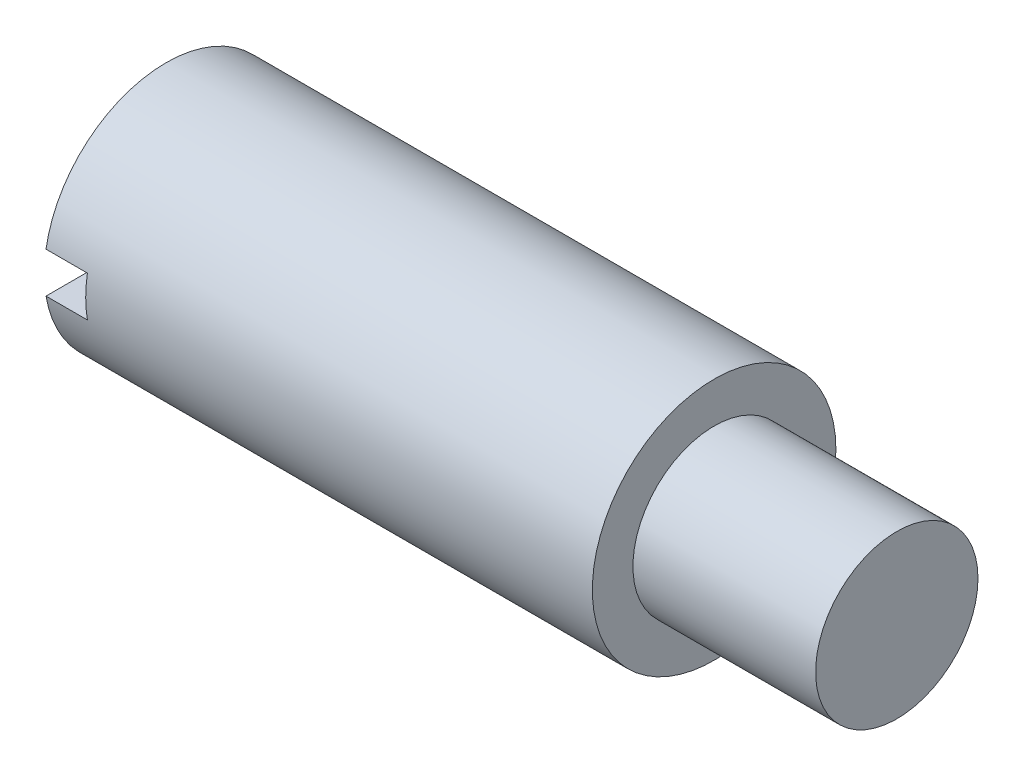
ISO-10303-21;
HEADER;
FILE_DESCRIPTION(('STEP AP214'),'2;1');
FILE_NAME('part.step','',(''),(''),'','','');
FILE_SCHEMA(('AUTOMOTIVE_DESIGN { 1 0 10303 214 1 1 1 1 }'));
ENDSEC;
DATA;
#1=APPLICATION_CONTEXT('core data for automotive mechanical design processes');
#2=APPLICATION_PROTOCOL_DEFINITION('international standard','automotive_design',2000,#1);
#3=PRODUCT_CONTEXT('',#1,'mechanical');
#4=PRODUCT('Part','Part','',(#3));
#5=PRODUCT_RELATED_PRODUCT_CATEGORY('part','',(#4));
#6=PRODUCT_DEFINITION_FORMATION('','',#4);
#7=PRODUCT_DEFINITION_CONTEXT('part definition',#1,'design');
#8=PRODUCT_DEFINITION('design','',#6,#7);
#9=PRODUCT_DEFINITION_SHAPE('','',#8);
#10=(LENGTH_UNIT() NAMED_UNIT(*) SI_UNIT(.MILLI.,.METRE.));
#11=(NAMED_UNIT(*) PLANE_ANGLE_UNIT() SI_UNIT($,.RADIAN.));
#12=(NAMED_UNIT(*) SI_UNIT($,.STERADIAN.) SOLID_ANGLE_UNIT());
#13=UNCERTAINTY_MEASURE_WITH_UNIT(LENGTH_MEASURE(1.E-05),#10,'distance_accuracy_value','');
#14=(GEOMETRIC_REPRESENTATION_CONTEXT(3) GLOBAL_UNCERTAINTY_ASSIGNED_CONTEXT((#13)) GLOBAL_UNIT_ASSIGNED_CONTEXT((#10,
#11,#12)) REPRESENTATION_CONTEXT('',''));
#15=CARTESIAN_POINT('',(0.,0.,0.));
#16=DIRECTION('',(0.,0.,1.));
#17=DIRECTION('',(1.,0.,0.));
#18=AXIS2_PLACEMENT_3D('',#15,#16,#17);
#19=CARTESIAN_POINT('',(-9.,0.,0.));
#20=DIRECTION('',(-1.,0.,0.));
#21=DIRECTION('',(0.,0.,1.));
#22=AXIS2_PLACEMENT_3D('',#19,#20,#21);
#23=PLANE('',#22);
#24=DIRECTION('',(0.,0.,1.));
#25=VECTOR('',#24,1.);
#26=CARTESIAN_POINT('',(-9.,-0.5,0.));
#27=LINE('',#26,#25);
#28=CARTESIAN_POINT('',(-9.,-0.5,-2.95803989154981));
#29=VERTEX_POINT('',#28);
#30=CARTESIAN_POINT('',(-9.,-0.5,2.95803989154981));
#31=VERTEX_POINT('',#30);
#32=EDGE_CURVE('E65',#29,#31,#27,.T.);
#33=ORIENTED_EDGE('',*,*,#32,.F.);
#34=CARTESIAN_POINT('',(-9.,0.,0.));
#35=DIRECTION('',(1.,0.,0.));
#36=DIRECTION('',(0.,0.,-1.));
#37=AXIS2_PLACEMENT_3D('',#34,#35,#36);
#38=CIRCLE('',#37,3.);
#39=EDGE_CURVE('E101',#31,#29,#38,.T.);
#40=ORIENTED_EDGE('',*,*,#39,.F.);
#41=EDGE_LOOP('',(#33,#40));
#42=FACE_BOUND('',#41,.T.);
#43=ADVANCED_FACE('F39',(#42),#23,.T.);
#44=CARTESIAN_POINT('',(4.5,3.,0.));
#45=DIRECTION('',(1.,0.,0.));
#46=DIRECTION('',(0.,0.,-1.));
#47=AXIS2_PLACEMENT_3D('',#44,#45,#46);
#48=PLANE('',#47);
#49=CARTESIAN_POINT('',(4.5,0.,0.));
#50=DIRECTION('',(1.,0.,0.));
#51=DIRECTION('',(0.,0.,-1.));
#52=AXIS2_PLACEMENT_3D('',#49,#50,#51);
#53=CIRCLE('',#52,3.);
#54=CARTESIAN_POINT('',(4.5,0.,-3.));
#55=VERTEX_POINT('',#54);
#56=EDGE_CURVE('E113',#55,#55,#53,.T.);
#57=ORIENTED_EDGE('',*,*,#56,.T.);
#58=EDGE_LOOP('',(#57));
#59=FACE_BOUND('',#58,.T.);
#60=CARTESIAN_POINT('',(4.5,0.,0.));
#61=DIRECTION('',(1.,0.,0.));
#62=DIRECTION('',(0.,0.,-1.));
#63=AXIS2_PLACEMENT_3D('',#60,#61,#62);
#64=CIRCLE('',#63,2.);
#65=CARTESIAN_POINT('',(4.5,0.,-2.));
#66=VERTEX_POINT('',#65);
#67=EDGE_CURVE('E105',#66,#66,#64,.T.);
#68=ORIENTED_EDGE('',*,*,#67,.F.);
#69=EDGE_LOOP('',(#68));
#70=FACE_BOUND('',#69,.T.);
#71=ADVANCED_FACE('F41',(#59,#70),#48,.T.);
#72=CARTESIAN_POINT('',(9.,0.,0.));
#73=DIRECTION('',(1.,0.,0.));
#74=DIRECTION('',(0.,0.,-1.));
#75=AXIS2_PLACEMENT_3D('',#72,#73,#74);
#76=CYLINDRICAL_SURFACE('',#75,3.);
#77=DIRECTION('',(1.,0.,0.));
#78=VECTOR('',#77,1.);
#79=CARTESIAN_POINT('',(9.,-0.5,-2.95803989154981));
#80=LINE('',#79,#78);
#81=CARTESIAN_POINT('',(-7.98,-0.5,-2.95803989154981));
#82=VERTEX_POINT('',#81);
#83=EDGE_CURVE('E97',#82,#29,#80,.F.);
#84=ORIENTED_EDGE('',*,*,#83,.F.);
#85=CARTESIAN_POINT('',(-7.98,0.,0.));
#86=DIRECTION('',(1.,0.,0.));
#87=DIRECTION('',(0.,0.,-1.));
#88=AXIS2_PLACEMENT_3D('',#85,#86,#87);
#89=CIRCLE('',#88,3.);
#90=CARTESIAN_POINT('',(-7.98,0.5,-2.95803989154981));
#91=VERTEX_POINT('',#90);
#92=EDGE_CURVE('E11',#91,#82,#89,.F.);
#93=ORIENTED_EDGE('',*,*,#92,.F.);
#94=DIRECTION('',(1.,0.,0.));
#95=VECTOR('',#94,1.);
#96=CARTESIAN_POINT('',(9.,0.5,-2.95803989154981));
#97=LINE('',#96,#95);
#98=CARTESIAN_POINT('',(-9.,0.5,-2.95803989154981));
#99=VERTEX_POINT('',#98);
#100=EDGE_CURVE('E76',#99,#91,#97,.T.);
#101=ORIENTED_EDGE('',*,*,#100,.F.);
#102=CARTESIAN_POINT('',(-9.,0.5,2.95803989154981));
#103=VERTEX_POINT('',#102);
#104=EDGE_CURVE('E111',#99,#103,#38,.T.);
#105=ORIENTED_EDGE('',*,*,#104,.T.);
#106=DIRECTION('',(1.,0.,0.));
#107=VECTOR('',#106,1.);
#108=CARTESIAN_POINT('',(9.,0.5,2.95803989154981));
#109=LINE('',#108,#107);
#110=CARTESIAN_POINT('',(-7.98,0.5,2.95803989154981));
#111=VERTEX_POINT('',#110);
#112=EDGE_CURVE('E53',#111,#103,#109,.F.);
#113=ORIENTED_EDGE('',*,*,#112,.F.);
#114=CARTESIAN_POINT('',(-7.98,-0.5,2.95803989154981));
#115=VERTEX_POINT('',#114);
#116=EDGE_CURVE('E43',#115,#111,#89,.F.);
#117=ORIENTED_EDGE('',*,*,#116,.F.);
#118=DIRECTION('',(1.,0.,0.));
#119=VECTOR('',#118,1.);
#120=CARTESIAN_POINT('',(9.,-0.5,2.95803989154981));
#121=LINE('',#120,#119);
#122=EDGE_CURVE('E103',#31,#115,#121,.T.);
#123=ORIENTED_EDGE('',*,*,#122,.F.);
#124=ORIENTED_EDGE('',*,*,#39,.T.);
#125=EDGE_LOOP('',(#84,#93,#101,#105,#113,#117,#123,#124));
#126=FACE_BOUND('',#125,.T.);
#127=ORIENTED_EDGE('',*,*,#56,.F.);
#128=EDGE_LOOP('',(#127));
#129=FACE_BOUND('',#128,.T.);
#130=ADVANCED_FACE('F96',(#126,#129),#76,.T.);
#131=DIRECTION('',(0.,0.,-1.));
#132=VECTOR('',#131,1.);
#133=CARTESIAN_POINT('',(-9.,0.5,0.));
#134=LINE('',#133,#132);
#135=EDGE_CURVE('E84',#103,#99,#134,.T.);
#136=ORIENTED_EDGE('',*,*,#135,.F.);
#137=ORIENTED_EDGE('',*,*,#104,.F.);
#138=EDGE_LOOP('',(#136,#137));
#139=FACE_BOUND('',#138,.T.);
#140=ADVANCED_FACE('F122',(#139),#23,.T.);
#141=CARTESIAN_POINT('',(9.,2.,0.));
#142=DIRECTION('',(1.,0.,0.));
#143=DIRECTION('',(0.,0.,-1.));
#144=AXIS2_PLACEMENT_3D('',#141,#142,#143);
#145=PLANE('',#144);
#146=CARTESIAN_POINT('',(9.,0.,0.));
#147=DIRECTION('',(1.,0.,0.));
#148=DIRECTION('',(0.,0.,-1.));
#149=AXIS2_PLACEMENT_3D('',#146,#147,#148);
#150=CIRCLE('',#149,2.);
#151=CARTESIAN_POINT('',(9.,0.,-2.));
#152=VERTEX_POINT('',#151);
#153=EDGE_CURVE('E106',#152,#152,#150,.T.);
#154=ORIENTED_EDGE('',*,*,#153,.T.);
#155=EDGE_LOOP('',(#154));
#156=FACE_BOUND('',#155,.T.);
#157=ADVANCED_FACE('F124',(#156),#145,.T.);
#158=CARTESIAN_POINT('',(9.,0.,0.));
#159=DIRECTION('',(1.,0.,0.));
#160=DIRECTION('',(0.,0.,-1.));
#161=AXIS2_PLACEMENT_3D('',#158,#159,#160);
#162=CYLINDRICAL_SURFACE('',#161,2.);
#163=ORIENTED_EDGE('',*,*,#67,.T.);
#164=EDGE_LOOP('',(#163));
#165=FACE_BOUND('',#164,.T.);
#166=ORIENTED_EDGE('',*,*,#153,.F.);
#167=EDGE_LOOP('',(#166));
#168=FACE_BOUND('',#167,.T.);
#169=ADVANCED_FACE('F128',(#165,#168),#162,.T.);
#170=CARTESIAN_POINT('',(-7.98,-0.5,-3.));
#171=DIRECTION('',(1.,0.,0.));
#172=DIRECTION('',(0.,0.,-1.));
#173=AXIS2_PLACEMENT_3D('',#170,#171,#172);
#174=PLANE('',#173);
#175=DIRECTION('',(0.,0.,1.));
#176=VECTOR('',#175,1.);
#177=CARTESIAN_POINT('',(-7.98,-0.5,-3.));
#178=LINE('',#177,#176);
#179=EDGE_CURVE('E86',#82,#115,#178,.T.);
#180=ORIENTED_EDGE('',*,*,#179,.T.);
#181=ORIENTED_EDGE('',*,*,#116,.T.);
#182=DIRECTION('',(0.,0.,1.));
#183=VECTOR('',#182,1.);
#184=CARTESIAN_POINT('',(-7.98,0.5,-3.));
#185=LINE('',#184,#183);
#186=EDGE_CURVE('E85',#91,#111,#185,.T.);
#187=ORIENTED_EDGE('',*,*,#186,.F.);
#188=ORIENTED_EDGE('',*,*,#92,.T.);
#189=EDGE_LOOP('',(#180,#181,#187,#188));
#190=FACE_BOUND('',#189,.T.);
#191=ADVANCED_FACE('F95',(#190),#174,.F.);
#192=CARTESIAN_POINT('',(-10.02,-0.5,-3.));
#193=DIRECTION('',(0.,-1.,0.));
#194=DIRECTION('',(0.,0.,-1.));
#195=AXIS2_PLACEMENT_3D('',#192,#193,#194);
#196=PLANE('',#195);
#197=ORIENTED_EDGE('',*,*,#83,.T.);
#198=ORIENTED_EDGE('',*,*,#32,.T.);
#199=ORIENTED_EDGE('',*,*,#122,.T.);
#200=ORIENTED_EDGE('',*,*,#179,.F.);
#201=EDGE_LOOP('',(#197,#198,#199,#200));
#202=FACE_BOUND('',#201,.T.);
#203=ADVANCED_FACE('F149',(#202),#196,.F.);
#204=CARTESIAN_POINT('',(-10.02,0.5,-3.));
#205=DIRECTION('',(0.,1.,0.));
#206=DIRECTION('',(0.,0.,1.));
#207=AXIS2_PLACEMENT_3D('',#204,#205,#206);
#208=PLANE('',#207);
#209=ORIENTED_EDGE('',*,*,#112,.T.);
#210=ORIENTED_EDGE('',*,*,#135,.T.);
#211=ORIENTED_EDGE('',*,*,#100,.T.);
#212=ORIENTED_EDGE('',*,*,#186,.T.);
#213=EDGE_LOOP('',(#209,#210,#211,#212));
#214=FACE_BOUND('',#213,.T.);
#215=ADVANCED_FACE('F82',(#214),#208,.F.);
#216=CLOSED_SHELL('',(#43,#71,#130,#140,#157,#169,#191,#203,#215));
#217=MANIFOLD_SOLID_BREP('B2',#216);
#218=ADVANCED_BREP_SHAPE_REPRESENTATION('',(#18,#217),#14);
#219=SHAPE_DEFINITION_REPRESENTATION(#9,#218);
ENDSEC;
END-ISO-10303-21;
